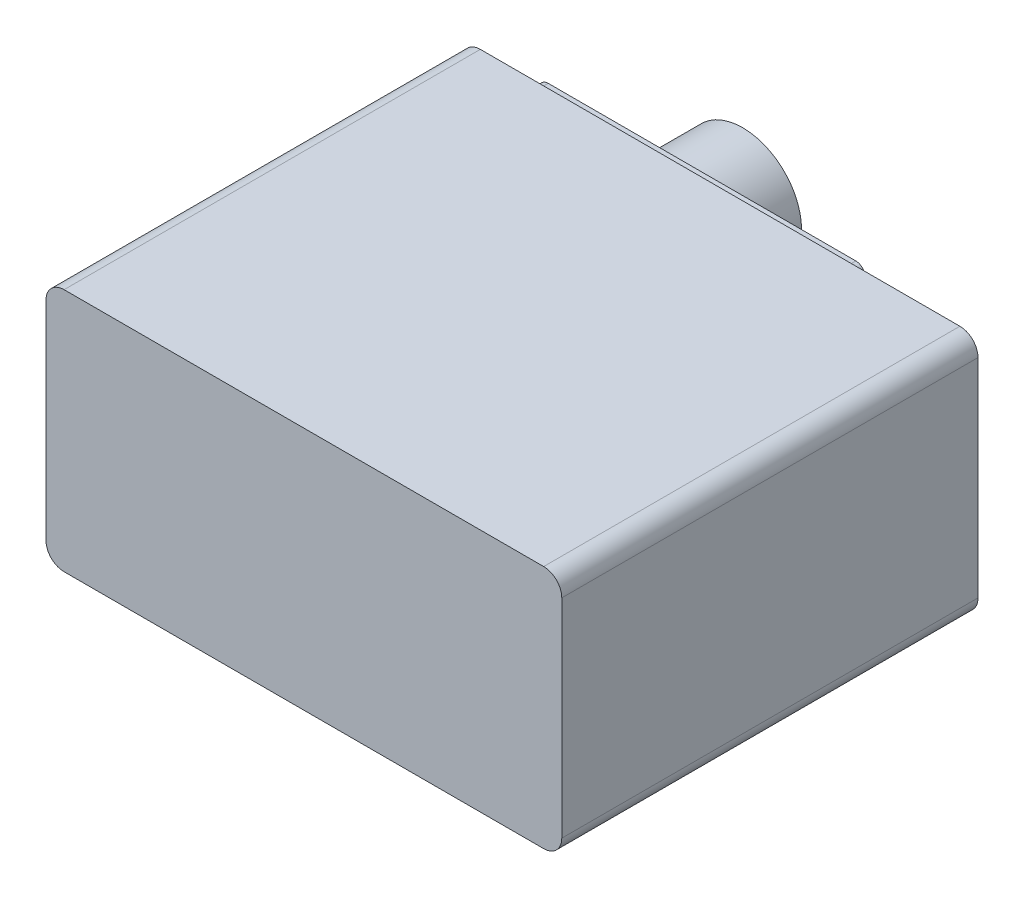
ISO-10303-21;
HEADER;
FILE_DESCRIPTION(('STEP AP214'),'2;1');
FILE_NAME('part.step','',(''),(''),'','','');
FILE_SCHEMA(('AUTOMOTIVE_DESIGN { 1 0 10303 214 1 1 1 1 }'));
ENDSEC;
DATA;
#1=APPLICATION_CONTEXT('core data for automotive mechanical design processes');
#2=APPLICATION_PROTOCOL_DEFINITION('international standard','automotive_design',2000,#1);
#3=PRODUCT_CONTEXT('',#1,'mechanical');
#4=PRODUCT('Part','Part','',(#3));
#5=PRODUCT_RELATED_PRODUCT_CATEGORY('part','',(#4));
#6=PRODUCT_DEFINITION_FORMATION('','',#4);
#7=PRODUCT_DEFINITION_CONTEXT('part definition',#1,'design');
#8=PRODUCT_DEFINITION('design','',#6,#7);
#9=PRODUCT_DEFINITION_SHAPE('','',#8);
#10=(LENGTH_UNIT() NAMED_UNIT(*) SI_UNIT(.MILLI.,.METRE.));
#11=(NAMED_UNIT(*) PLANE_ANGLE_UNIT() SI_UNIT($,.RADIAN.));
#12=(NAMED_UNIT(*) SI_UNIT($,.STERADIAN.) SOLID_ANGLE_UNIT());
#13=UNCERTAINTY_MEASURE_WITH_UNIT(LENGTH_MEASURE(1.E-05),#10,'distance_accuracy_value','');
#14=(GEOMETRIC_REPRESENTATION_CONTEXT(3) GLOBAL_UNCERTAINTY_ASSIGNED_CONTEXT((#13)) GLOBAL_UNIT_ASSIGNED_CONTEXT((#10,
#11,#12)) REPRESENTATION_CONTEXT('',''));
#15=CARTESIAN_POINT('',(0.,0.,0.));
#16=DIRECTION('',(0.,0.,1.));
#17=DIRECTION('',(1.,0.,0.));
#18=AXIS2_PLACEMENT_3D('',#15,#16,#17);
#19=CARTESIAN_POINT('',(12.,-10.,-4.));
#20=DIRECTION('',(-1.,0.,0.));
#21=DIRECTION('',(0.,0.,1.));
#22=AXIS2_PLACEMENT_3D('',#19,#20,#21);
#23=PLANE('',#22);
#24=DIRECTION('',(0.,0.,1.));
#25=VECTOR('',#24,1.);
#26=CARTESIAN_POINT('',(12.,-5.,-4.));
#27=LINE('',#26,#25);
#28=CARTESIAN_POINT('',(12.,-5.,-4.));
#29=VERTEX_POINT('',#28);
#30=CARTESIAN_POINT('',(12.,-5.,0.));
#31=VERTEX_POINT('',#30);
#32=EDGE_CURVE('E54',#29,#31,#27,.T.);
#33=ORIENTED_EDGE('',*,*,#32,.T.);
#34=DIRECTION('',(0.,-1.,0.));
#35=VECTOR('',#34,1.);
#36=CARTESIAN_POINT('',(12.,-10.,0.));
#37=LINE('',#36,#35);
#38=CARTESIAN_POINT('',(12.,-9.,0.));
#39=VERTEX_POINT('',#38);
#40=EDGE_CURVE('E203',#31,#39,#37,.T.);
#41=ORIENTED_EDGE('',*,*,#40,.T.);
#42=DIRECTION('',(0.,0.,1.));
#43=VECTOR('',#42,1.);
#44=CARTESIAN_POINT('',(12.,-9.,-4.));
#45=LINE('',#44,#43);
#46=CARTESIAN_POINT('',(12.,-9.,-4.));
#47=VERTEX_POINT('',#46);
#48=EDGE_CURVE('E270',#39,#47,#45,.F.);
#49=ORIENTED_EDGE('',*,*,#48,.T.);
#50=DIRECTION('',(0.,-1.,0.));
#51=VECTOR('',#50,1.);
#52=CARTESIAN_POINT('',(12.,-10.,-4.));
#53=LINE('',#52,#51);
#54=EDGE_CURVE('E188',#29,#47,#53,.T.);
#55=ORIENTED_EDGE('',*,*,#54,.F.);
#56=EDGE_LOOP('',(#33,#41,#49,#55));
#57=FACE_BOUND('',#56,.T.);
#58=ADVANCED_FACE('F39',(#57),#23,.F.);
#59=DIRECTION('',(0.,0.,1.));
#60=VECTOR('',#59,1.);
#61=CARTESIAN_POINT('',(12.,5.,-4.));
#62=LINE('',#61,#60);
#63=CARTESIAN_POINT('',(12.,5.,-4.));
#64=VERTEX_POINT('',#63);
#65=CARTESIAN_POINT('',(12.,5.,0.));
#66=VERTEX_POINT('',#65);
#67=EDGE_CURVE('E165',#64,#66,#62,.T.);
#68=ORIENTED_EDGE('',*,*,#67,.F.);
#69=CARTESIAN_POINT('',(12.,9.00000000000001,-4.));
#70=VERTEX_POINT('',#69);
#71=EDGE_CURVE('E177',#70,#64,#53,.T.);
#72=ORIENTED_EDGE('',*,*,#71,.F.);
#73=DIRECTION('',(0.,0.,1.));
#74=VECTOR('',#73,1.);
#75=CARTESIAN_POINT('',(12.,9.00000000000001,-4.));
#76=LINE('',#75,#74);
#77=CARTESIAN_POINT('',(12.,9.00000000000001,0.));
#78=VERTEX_POINT('',#77);
#79=EDGE_CURVE('E273',#70,#78,#76,.T.);
#80=ORIENTED_EDGE('',*,*,#79,.T.);
#81=EDGE_CURVE('E180',#78,#66,#37,.T.);
#82=ORIENTED_EDGE('',*,*,#81,.T.);
#83=EDGE_LOOP('',(#68,#72,#80,#82));
#84=FACE_BOUND('',#83,.T.);
#85=ADVANCED_FACE('F175',(#84),#23,.F.);
#86=CARTESIAN_POINT('',(0.,0.,0.));
#87=DIRECTION('',(0.,0.,1.));
#88=DIRECTION('',(1.,0.,0.));
#89=AXIS2_PLACEMENT_3D('',#86,#87,#88);
#90=PLANE('',#89);
#91=CARTESIAN_POINT('',(12.,0.,0.));
#92=DIRECTION('',(0.,0.,-1.));
#93=DIRECTION('',(-1.,0.,0.));
#94=AXIS2_PLACEMENT_3D('',#91,#92,#93);
#95=CIRCLE('',#94,5.);
#96=EDGE_CURVE('E170',#66,#31,#95,.T.);
#97=ORIENTED_EDGE('',*,*,#96,.F.);
#98=ORIENTED_EDGE('',*,*,#81,.F.);
#99=CARTESIAN_POINT('',(11.,9.00000000000001,0.));
#100=DIRECTION('',(0.,0.,1.));
#101=DIRECTION('',(1.,0.,0.));
#102=AXIS2_PLACEMENT_3D('',#99,#100,#101);
#103=CIRCLE('',#102,1.);
#104=CARTESIAN_POINT('',(11.,10.,0.));
#105=VERTEX_POINT('',#104);
#106=EDGE_CURVE('E297',#78,#105,#103,.T.);
#107=ORIENTED_EDGE('',*,*,#106,.T.);
#108=DIRECTION('',(1.,0.,0.));
#109=VECTOR('',#108,1.);
#110=CARTESIAN_POINT('',(12.,10.,0.));
#111=LINE('',#110,#109);
#112=CARTESIAN_POINT('',(-23.,10.,0.));
#113=VERTEX_POINT('',#112);
#114=EDGE_CURVE('E200',#113,#105,#111,.T.);
#115=ORIENTED_EDGE('',*,*,#114,.F.);
#116=CARTESIAN_POINT('',(-23.,9.,0.));
#117=DIRECTION('',(0.,0.,1.));
#118=DIRECTION('',(1.,0.,0.));
#119=AXIS2_PLACEMENT_3D('',#116,#117,#118);
#120=CIRCLE('',#119,1.);
#121=CARTESIAN_POINT('',(-24.,9.,0.));
#122=VERTEX_POINT('',#121);
#123=EDGE_CURVE('E299',#113,#122,#120,.T.);
#124=ORIENTED_EDGE('',*,*,#123,.T.);
#125=DIRECTION('',(0.,1.,0.));
#126=VECTOR('',#125,1.);
#127=CARTESIAN_POINT('',(-24.,10.,0.));
#128=LINE('',#127,#126);
#129=CARTESIAN_POINT('',(-24.,-9.,0.));
#130=VERTEX_POINT('',#129);
#131=EDGE_CURVE('E208',#130,#122,#128,.T.);
#132=ORIENTED_EDGE('',*,*,#131,.F.);
#133=CARTESIAN_POINT('',(-23.,-9.,0.));
#134=DIRECTION('',(0.,0.,1.));
#135=DIRECTION('',(1.,0.,0.));
#136=AXIS2_PLACEMENT_3D('',#133,#134,#135);
#137=CIRCLE('',#136,1.);
#138=CARTESIAN_POINT('',(-23.,-10.,0.));
#139=VERTEX_POINT('',#138);
#140=EDGE_CURVE('E62',#130,#139,#137,.T.);
#141=ORIENTED_EDGE('',*,*,#140,.T.);
#142=DIRECTION('',(-1.,0.,0.));
#143=VECTOR('',#142,1.);
#144=CARTESIAN_POINT('',(-24.,-10.,0.));
#145=LINE('',#144,#143);
#146=CARTESIAN_POINT('',(11.,-10.,0.));
#147=VERTEX_POINT('',#146);
#148=EDGE_CURVE('E206',#147,#139,#145,.T.);
#149=ORIENTED_EDGE('',*,*,#148,.F.);
#150=CARTESIAN_POINT('',(11.,-9.,0.));
#151=DIRECTION('',(0.,0.,1.));
#152=DIRECTION('',(1.,0.,0.));
#153=AXIS2_PLACEMENT_3D('',#150,#151,#152);
#154=CIRCLE('',#153,1.);
#155=EDGE_CURVE('E47',#147,#39,#154,.T.);
#156=ORIENTED_EDGE('',*,*,#155,.T.);
#157=ORIENTED_EDGE('',*,*,#40,.F.);
#158=EDGE_LOOP('',(#97,#98,#107,#115,#124,#132,#141,#149,#156,#157));
#159=FACE_BOUND('',#158,.T.);
#160=DIRECTION('',(0.,-1.,0.));
#161=VECTOR('',#160,1.);
#162=CARTESIAN_POINT('',(-28.5,13.5,0.));
#163=LINE('',#162,#161);
#164=CARTESIAN_POINT('',(-28.5,11.5,0.));
#165=VERTEX_POINT('',#164);
#166=CARTESIAN_POINT('',(-28.5,-11.5,0.));
#167=VERTEX_POINT('',#166);
#168=EDGE_CURVE('E215',#165,#167,#163,.T.);
#169=ORIENTED_EDGE('',*,*,#168,.F.);
#170=CARTESIAN_POINT('',(-26.5,11.5,0.));
#171=DIRECTION('',(0.,0.,1.));
#172=DIRECTION('',(1.,0.,0.));
#173=AXIS2_PLACEMENT_3D('',#170,#171,#172);
#174=CIRCLE('',#173,2.);
#175=CARTESIAN_POINT('',(-26.5,13.5,0.));
#176=VERTEX_POINT('',#175);
#177=EDGE_CURVE('E245',#165,#176,#174,.F.);
#178=ORIENTED_EDGE('',*,*,#177,.T.);
#179=DIRECTION('',(-1.,0.,0.));
#180=VECTOR('',#179,1.);
#181=CARTESIAN_POINT('',(28.5,13.5,0.));
#182=LINE('',#181,#180);
#183=CARTESIAN_POINT('',(26.5,13.5,0.));
#184=VERTEX_POINT('',#183);
#185=EDGE_CURVE('E230',#184,#176,#182,.T.);
#186=ORIENTED_EDGE('',*,*,#185,.F.);
#187=CARTESIAN_POINT('',(26.5,11.5,0.));
#188=DIRECTION('',(0.,0.,1.));
#189=DIRECTION('',(1.,0.,0.));
#190=AXIS2_PLACEMENT_3D('',#187,#188,#189);
#191=CIRCLE('',#190,2.);
#192=CARTESIAN_POINT('',(28.5,11.5,0.));
#193=VERTEX_POINT('',#192);
#194=EDGE_CURVE('E243',#184,#193,#191,.F.);
#195=ORIENTED_EDGE('',*,*,#194,.T.);
#196=DIRECTION('',(0.,1.,0.));
#197=VECTOR('',#196,1.);
#198=CARTESIAN_POINT('',(28.5,-13.5,0.));
#199=LINE('',#198,#197);
#200=CARTESIAN_POINT('',(28.5,-11.5,0.));
#201=VERTEX_POINT('',#200);
#202=EDGE_CURVE('E227',#201,#193,#199,.T.);
#203=ORIENTED_EDGE('',*,*,#202,.F.);
#204=CARTESIAN_POINT('',(26.5,-11.5,0.));
#205=DIRECTION('',(0.,0.,1.));
#206=DIRECTION('',(1.,0.,0.));
#207=AXIS2_PLACEMENT_3D('',#204,#205,#206);
#208=CIRCLE('',#207,2.);
#209=CARTESIAN_POINT('',(26.5,-13.5,0.));
#210=VERTEX_POINT('',#209);
#211=EDGE_CURVE('E241',#201,#210,#208,.F.);
#212=ORIENTED_EDGE('',*,*,#211,.T.);
#213=DIRECTION('',(1.,0.,0.));
#214=VECTOR('',#213,1.);
#215=CARTESIAN_POINT('',(0.,-13.5,0.));
#216=LINE('',#215,#214);
#217=CARTESIAN_POINT('',(-26.5,-13.5,0.));
#218=VERTEX_POINT('',#217);
#219=EDGE_CURVE('E199',#218,#210,#216,.T.);
#220=ORIENTED_EDGE('',*,*,#219,.F.);
#221=CARTESIAN_POINT('',(-26.5,-11.5,0.));
#222=DIRECTION('',(0.,0.,1.));
#223=DIRECTION('',(1.,0.,0.));
#224=AXIS2_PLACEMENT_3D('',#221,#222,#223);
#225=CIRCLE('',#224,2.);
#226=EDGE_CURVE('E239',#218,#167,#225,.F.);
#227=ORIENTED_EDGE('',*,*,#226,.T.);
#228=EDGE_LOOP('',(#169,#178,#186,#195,#203,#212,#220,#227));
#229=FACE_BOUND('',#228,.T.);
#230=ADVANCED_FACE('F304',(#159,#229),#90,.F.);
#231=CARTESIAN_POINT('',(0.,-13.5,46.));
#232=DIRECTION('',(0.,1.,0.));
#233=DIRECTION('',(0.,0.,1.));
#234=AXIS2_PLACEMENT_3D('',#231,#232,#233);
#235=PLANE('',#234);
#236=ORIENTED_EDGE('',*,*,#219,.T.);
#237=DIRECTION('',(0.,0.,-1.));
#238=VECTOR('',#237,1.);
#239=CARTESIAN_POINT('',(26.5,-13.5,46.));
#240=LINE('',#239,#238);
#241=CARTESIAN_POINT('',(26.5,-13.5,46.));
#242=VERTEX_POINT('',#241);
#243=EDGE_CURVE('E268',#210,#242,#240,.F.);
#244=ORIENTED_EDGE('',*,*,#243,.T.);
#245=DIRECTION('',(1.,0.,0.));
#246=VECTOR('',#245,1.);
#247=CARTESIAN_POINT('',(-28.5,-13.5,46.));
#248=LINE('',#247,#246);
#249=CARTESIAN_POINT('',(-26.5,-13.5,46.));
#250=VERTEX_POINT('',#249);
#251=EDGE_CURVE('E211',#250,#242,#248,.T.);
#252=ORIENTED_EDGE('',*,*,#251,.F.);
#253=DIRECTION('',(0.,0.,-1.));
#254=VECTOR('',#253,1.);
#255=CARTESIAN_POINT('',(-26.5,-13.5,46.));
#256=LINE('',#255,#254);
#257=EDGE_CURVE('E265',#250,#218,#256,.T.);
#258=ORIENTED_EDGE('',*,*,#257,.T.);
#259=EDGE_LOOP('',(#236,#244,#252,#258));
#260=FACE_BOUND('',#259,.T.);
#261=ADVANCED_FACE('F368',(#260),#235,.F.);
#262=CARTESIAN_POINT('',(28.5,-13.5,46.));
#263=DIRECTION('',(-1.,0.,0.));
#264=DIRECTION('',(0.,0.,1.));
#265=AXIS2_PLACEMENT_3D('',#262,#263,#264);
#266=PLANE('',#265);
#267=ORIENTED_EDGE('',*,*,#202,.T.);
#268=DIRECTION('',(0.,0.,-1.));
#269=VECTOR('',#268,1.);
#270=CARTESIAN_POINT('',(28.5,11.5,46.));
#271=LINE('',#270,#269);
#272=CARTESIAN_POINT('',(28.5,11.5,46.));
#273=VERTEX_POINT('',#272);
#274=EDGE_CURVE('E263',#193,#273,#271,.F.);
#275=ORIENTED_EDGE('',*,*,#274,.T.);
#276=DIRECTION('',(0.,1.,0.));
#277=VECTOR('',#276,1.);
#278=CARTESIAN_POINT('',(28.5,-13.5,46.));
#279=LINE('',#278,#277);
#280=CARTESIAN_POINT('',(28.5,-11.5,46.));
#281=VERTEX_POINT('',#280);
#282=EDGE_CURVE('E214',#281,#273,#279,.T.);
#283=ORIENTED_EDGE('',*,*,#282,.F.);
#284=DIRECTION('',(0.,0.,-1.));
#285=VECTOR('',#284,1.);
#286=CARTESIAN_POINT('',(28.5,-11.5,46.));
#287=LINE('',#286,#285);
#288=EDGE_CURVE('E260',#281,#201,#287,.T.);
#289=ORIENTED_EDGE('',*,*,#288,.T.);
#290=EDGE_LOOP('',(#267,#275,#283,#289));
#291=FACE_BOUND('',#290,.T.);
#292=ADVANCED_FACE('F375',(#291),#266,.F.);
#293=CARTESIAN_POINT('',(28.5,13.5,46.));
#294=DIRECTION('',(0.,-1.,0.));
#295=DIRECTION('',(1.,0.,0.));
#296=AXIS2_PLACEMENT_3D('',#293,#294,#295);
#297=PLANE('',#296);
#298=ORIENTED_EDGE('',*,*,#185,.T.);
#299=DIRECTION('',(0.,0.,-1.));
#300=VECTOR('',#299,1.);
#301=CARTESIAN_POINT('',(-26.5,13.5,46.));
#302=LINE('',#301,#300);
#303=CARTESIAN_POINT('',(-26.5,13.5,46.));
#304=VERTEX_POINT('',#303);
#305=EDGE_CURVE('E250',#176,#304,#302,.F.);
#306=ORIENTED_EDGE('',*,*,#305,.T.);
#307=DIRECTION('',(-1.,0.,0.));
#308=VECTOR('',#307,1.);
#309=CARTESIAN_POINT('',(28.5,13.5,46.));
#310=LINE('',#309,#308);
#311=CARTESIAN_POINT('',(26.5,13.5,46.));
#312=VERTEX_POINT('',#311);
#313=EDGE_CURVE('E218',#312,#304,#310,.T.);
#314=ORIENTED_EDGE('',*,*,#313,.F.);
#315=DIRECTION('',(0.,0.,-1.));
#316=VECTOR('',#315,1.);
#317=CARTESIAN_POINT('',(26.5,13.5,46.));
#318=LINE('',#317,#316);
#319=EDGE_CURVE('E247',#312,#184,#318,.T.);
#320=ORIENTED_EDGE('',*,*,#319,.T.);
#321=EDGE_LOOP('',(#298,#306,#314,#320));
#322=FACE_BOUND('',#321,.T.);
#323=ADVANCED_FACE('F371',(#322),#297,.F.);
#324=CARTESIAN_POINT('',(-28.5,13.5,46.));
#325=DIRECTION('',(1.,0.,0.));
#326=DIRECTION('',(0.,1.,0.));
#327=AXIS2_PLACEMENT_3D('',#324,#325,#326);
#328=PLANE('',#327);
#329=DIRECTION('',(0.,-1.,0.));
#330=VECTOR('',#329,1.);
#331=CARTESIAN_POINT('',(-28.5,13.5,46.));
#332=LINE('',#331,#330);
#333=CARTESIAN_POINT('',(-28.5,11.5,46.));
#334=VERTEX_POINT('',#333);
#335=CARTESIAN_POINT('',(-28.5,-11.5,46.));
#336=VERTEX_POINT('',#335);
#337=EDGE_CURVE('E221',#334,#336,#332,.T.);
#338=ORIENTED_EDGE('',*,*,#337,.F.);
#339=DIRECTION('',(0.,0.,-1.));
#340=VECTOR('',#339,1.);
#341=CARTESIAN_POINT('',(-28.5,11.5,46.));
#342=LINE('',#341,#340);
#343=EDGE_CURVE('E236',#334,#165,#342,.T.);
#344=ORIENTED_EDGE('',*,*,#343,.T.);
#345=ORIENTED_EDGE('',*,*,#168,.T.);
#346=DIRECTION('',(0.,0.,-1.));
#347=VECTOR('',#346,1.);
#348=CARTESIAN_POINT('',(-28.5,-11.5,46.));
#349=LINE('',#348,#347);
#350=EDGE_CURVE('E224',#167,#336,#349,.F.);
#351=ORIENTED_EDGE('',*,*,#350,.T.);
#352=EDGE_LOOP('',(#338,#344,#345,#351));
#353=FACE_BOUND('',#352,.T.);
#354=ADVANCED_FACE('F364',(#353),#328,.F.);
#355=CARTESIAN_POINT('',(0.,0.,46.));
#356=DIRECTION('',(0.,0.,1.));
#357=DIRECTION('',(1.,0.,0.));
#358=AXIS2_PLACEMENT_3D('',#355,#356,#357);
#359=PLANE('',#358);
#360=ORIENTED_EDGE('',*,*,#313,.T.);
#361=CARTESIAN_POINT('',(-26.5,11.5,46.));
#362=DIRECTION('',(0.,0.,1.));
#363=DIRECTION('',(1.,0.,0.));
#364=AXIS2_PLACEMENT_3D('',#361,#362,#363);
#365=CIRCLE('',#364,2.);
#366=EDGE_CURVE('E258',#304,#334,#365,.T.);
#367=ORIENTED_EDGE('',*,*,#366,.T.);
#368=ORIENTED_EDGE('',*,*,#337,.T.);
#369=CARTESIAN_POINT('',(-26.5,-11.5,46.));
#370=DIRECTION('',(0.,0.,1.));
#371=DIRECTION('',(1.,0.,0.));
#372=AXIS2_PLACEMENT_3D('',#369,#370,#371);
#373=CIRCLE('',#372,2.);
#374=EDGE_CURVE('E252',#336,#250,#373,.T.);
#375=ORIENTED_EDGE('',*,*,#374,.T.);
#376=ORIENTED_EDGE('',*,*,#251,.T.);
#377=CARTESIAN_POINT('',(26.5,-11.5,46.));
#378=DIRECTION('',(0.,0.,1.));
#379=DIRECTION('',(1.,0.,0.));
#380=AXIS2_PLACEMENT_3D('',#377,#378,#379);
#381=CIRCLE('',#380,2.);
#382=EDGE_CURVE('E254',#242,#281,#381,.T.);
#383=ORIENTED_EDGE('',*,*,#382,.T.);
#384=ORIENTED_EDGE('',*,*,#282,.T.);
#385=CARTESIAN_POINT('',(26.5,11.5,46.));
#386=DIRECTION('',(0.,0.,1.));
#387=DIRECTION('',(1.,0.,0.));
#388=AXIS2_PLACEMENT_3D('',#385,#386,#387);
#389=CIRCLE('',#388,2.);
#390=EDGE_CURVE('E256',#273,#312,#389,.T.);
#391=ORIENTED_EDGE('',*,*,#390,.T.);
#392=EDGE_LOOP('',(#360,#367,#368,#375,#376,#383,#384,#391));
#393=FACE_BOUND('',#392,.T.);
#394=ADVANCED_FACE('F360',(#393),#359,.T.);
#395=CARTESIAN_POINT('',(-26.5,11.5,46.));
#396=DIRECTION('',(0.,0.,-1.));
#397=DIRECTION('',(-1.,0.,0.));
#398=AXIS2_PLACEMENT_3D('',#395,#396,#397);
#399=CYLINDRICAL_SURFACE('',#398,2.);
#400=ORIENTED_EDGE('',*,*,#366,.F.);
#401=ORIENTED_EDGE('',*,*,#305,.F.);
#402=ORIENTED_EDGE('',*,*,#177,.F.);
#403=ORIENTED_EDGE('',*,*,#343,.F.);
#404=EDGE_LOOP('',(#400,#401,#402,#403));
#405=FACE_BOUND('',#404,.T.);
#406=ADVANCED_FACE('F363',(#405),#399,.T.);
#407=CARTESIAN_POINT('',(26.5,11.5,46.));
#408=DIRECTION('',(0.,0.,-1.));
#409=DIRECTION('',(-1.,0.,0.));
#410=AXIS2_PLACEMENT_3D('',#407,#408,#409);
#411=CYLINDRICAL_SURFACE('',#410,2.);
#412=ORIENTED_EDGE('',*,*,#390,.F.);
#413=ORIENTED_EDGE('',*,*,#274,.F.);
#414=ORIENTED_EDGE('',*,*,#194,.F.);
#415=ORIENTED_EDGE('',*,*,#319,.F.);
#416=EDGE_LOOP('',(#412,#413,#414,#415));
#417=FACE_BOUND('',#416,.T.);
#418=ADVANCED_FACE('F385',(#417),#411,.T.);
#419=CARTESIAN_POINT('',(26.5,-11.5,46.));
#420=DIRECTION('',(0.,0.,-1.));
#421=DIRECTION('',(-1.,0.,0.));
#422=AXIS2_PLACEMENT_3D('',#419,#420,#421);
#423=CYLINDRICAL_SURFACE('',#422,2.);
#424=ORIENTED_EDGE('',*,*,#382,.F.);
#425=ORIENTED_EDGE('',*,*,#243,.F.);
#426=ORIENTED_EDGE('',*,*,#211,.F.);
#427=ORIENTED_EDGE('',*,*,#288,.F.);
#428=EDGE_LOOP('',(#424,#425,#426,#427));
#429=FACE_BOUND('',#428,.T.);
#430=ADVANCED_FACE('F389',(#429),#423,.T.);
#431=CARTESIAN_POINT('',(-26.5,-11.5,46.));
#432=DIRECTION('',(0.,0.,-1.));
#433=DIRECTION('',(-1.,0.,0.));
#434=AXIS2_PLACEMENT_3D('',#431,#432,#433);
#435=CYLINDRICAL_SURFACE('',#434,2.);
#436=ORIENTED_EDGE('',*,*,#374,.F.);
#437=ORIENTED_EDGE('',*,*,#350,.F.);
#438=ORIENTED_EDGE('',*,*,#226,.F.);
#439=ORIENTED_EDGE('',*,*,#257,.F.);
#440=EDGE_LOOP('',(#436,#437,#438,#439));
#441=FACE_BOUND('',#440,.T.);
#442=ADVANCED_FACE('F358',(#441),#435,.T.);
#443=CARTESIAN_POINT('',(12.,10.,-4.));
#444=DIRECTION('',(0.,-1.,0.));
#445=DIRECTION('',(1.,0.,0.));
#446=AXIS2_PLACEMENT_3D('',#443,#444,#445);
#447=PLANE('',#446);
#448=ORIENTED_EDGE('',*,*,#114,.T.);
#449=DIRECTION('',(0.,0.,1.));
#450=VECTOR('',#449,1.);
#451=CARTESIAN_POINT('',(11.,10.,-4.));
#452=LINE('',#451,#450);
#453=CARTESIAN_POINT('',(11.,10.,-4.));
#454=VERTEX_POINT('',#453);
#455=EDGE_CURVE('E278',#105,#454,#452,.F.);
#456=ORIENTED_EDGE('',*,*,#455,.T.);
#457=DIRECTION('',(1.,0.,0.));
#458=VECTOR('',#457,1.);
#459=CARTESIAN_POINT('',(12.,10.,-4.));
#460=LINE('',#459,#458);
#461=CARTESIAN_POINT('',(-23.,10.,-4.));
#462=VERTEX_POINT('',#461);
#463=EDGE_CURVE('E193',#462,#454,#460,.T.);
#464=ORIENTED_EDGE('',*,*,#463,.F.);
#465=DIRECTION('',(0.,0.,1.));
#466=VECTOR('',#465,1.);
#467=CARTESIAN_POINT('',(-23.,10.,-4.));
#468=LINE('',#467,#466);
#469=EDGE_CURVE('E275',#462,#113,#468,.T.);
#470=ORIENTED_EDGE('',*,*,#469,.T.);
#471=EDGE_LOOP('',(#448,#456,#464,#470));
#472=FACE_BOUND('',#471,.T.);
#473=ADVANCED_FACE('F355',(#472),#447,.F.);
#474=CARTESIAN_POINT('',(-24.,-10.,-4.));
#475=DIRECTION('',(0.,1.,0.));
#476=DIRECTION('',(0.,0.,1.));
#477=AXIS2_PLACEMENT_3D('',#474,#475,#476);
#478=PLANE('',#477);
#479=ORIENTED_EDGE('',*,*,#148,.T.);
#480=DIRECTION('',(0.,0.,1.));
#481=VECTOR('',#480,1.);
#482=CARTESIAN_POINT('',(-23.,-10.,-4.));
#483=LINE('',#482,#481);
#484=CARTESIAN_POINT('',(-23.,-10.,-4.));
#485=VERTEX_POINT('',#484);
#486=EDGE_CURVE('E295',#139,#485,#483,.F.);
#487=ORIENTED_EDGE('',*,*,#486,.T.);
#488=DIRECTION('',(-1.,0.,0.));
#489=VECTOR('',#488,1.);
#490=CARTESIAN_POINT('',(-24.,-10.,-4.));
#491=LINE('',#490,#489);
#492=CARTESIAN_POINT('',(11.,-10.,-4.));
#493=VERTEX_POINT('',#492);
#494=EDGE_CURVE('E187',#493,#485,#491,.T.);
#495=ORIENTED_EDGE('',*,*,#494,.F.);
#496=DIRECTION('',(0.,0.,1.));
#497=VECTOR('',#496,1.);
#498=CARTESIAN_POINT('',(11.,-10.,-4.));
#499=LINE('',#498,#497);
#500=EDGE_CURVE('E292',#493,#147,#499,.T.);
#501=ORIENTED_EDGE('',*,*,#500,.T.);
#502=EDGE_LOOP('',(#479,#487,#495,#501));
#503=FACE_BOUND('',#502,.T.);
#504=ADVANCED_FACE('F345',(#503),#478,.F.);
#505=CARTESIAN_POINT('',(-24.,10.,-4.));
#506=DIRECTION('',(1.,0.,0.));
#507=DIRECTION('',(0.,1.,0.));
#508=AXIS2_PLACEMENT_3D('',#505,#506,#507);
#509=PLANE('',#508);
#510=ORIENTED_EDGE('',*,*,#131,.T.);
#511=DIRECTION('',(0.,0.,1.));
#512=VECTOR('',#511,1.);
#513=CARTESIAN_POINT('',(-24.,9.,-4.));
#514=LINE('',#513,#512);
#515=CARTESIAN_POINT('',(-24.,9.,-4.));
#516=VERTEX_POINT('',#515);
#517=EDGE_CURVE('E290',#122,#516,#514,.F.);
#518=ORIENTED_EDGE('',*,*,#517,.T.);
#519=DIRECTION('',(0.,1.,0.));
#520=VECTOR('',#519,1.);
#521=CARTESIAN_POINT('',(-24.,10.,-4.));
#522=LINE('',#521,#520);
#523=CARTESIAN_POINT('',(-24.,-9.,-4.));
#524=VERTEX_POINT('',#523);
#525=EDGE_CURVE('E191',#524,#516,#522,.T.);
#526=ORIENTED_EDGE('',*,*,#525,.F.);
#527=DIRECTION('',(0.,0.,1.));
#528=VECTOR('',#527,1.);
#529=CARTESIAN_POINT('',(-24.,-9.,-4.));
#530=LINE('',#529,#528);
#531=EDGE_CURVE('E287',#524,#130,#530,.T.);
#532=ORIENTED_EDGE('',*,*,#531,.T.);
#533=EDGE_LOOP('',(#510,#518,#526,#532));
#534=FACE_BOUND('',#533,.T.);
#535=ADVANCED_FACE('F336',(#534),#509,.F.);
#536=CARTESIAN_POINT('',(0.,0.,-4.));
#537=DIRECTION('',(0.,0.,1.));
#538=DIRECTION('',(1.,0.,0.));
#539=AXIS2_PLACEMENT_3D('',#536,#537,#538);
#540=PLANE('',#539);
#541=CARTESIAN_POINT('',(-11.5,0.,-4.));
#542=DIRECTION('',(0.,0.,1.));
#543=DIRECTION('',(1.,0.,0.));
#544=AXIS2_PLACEMENT_3D('',#541,#542,#543);
#545=CIRCLE('',#544,6.5);
#546=CARTESIAN_POINT('',(-5.,0.,-4.));
#547=VERTEX_POINT('',#546);
#548=EDGE_CURVE('E11',#547,#547,#545,.F.);
#549=ORIENTED_EDGE('',*,*,#548,.F.);
#550=EDGE_LOOP('',(#549));
#551=FACE_BOUND('',#550,.T.);
#552=ORIENTED_EDGE('',*,*,#463,.T.);
#553=CARTESIAN_POINT('',(11.,9.00000000000001,-4.));
#554=DIRECTION('',(0.,0.,1.));
#555=DIRECTION('',(1.,0.,0.));
#556=AXIS2_PLACEMENT_3D('',#553,#554,#555);
#557=CIRCLE('',#556,1.);
#558=EDGE_CURVE('E186',#454,#70,#557,.F.);
#559=ORIENTED_EDGE('',*,*,#558,.T.);
#560=ORIENTED_EDGE('',*,*,#71,.T.);
#561=CARTESIAN_POINT('',(12.,0.,-4.));
#562=DIRECTION('',(0.,0.,-1.));
#563=DIRECTION('',(-1.,0.,0.));
#564=AXIS2_PLACEMENT_3D('',#561,#562,#563);
#565=CIRCLE('',#564,5.);
#566=EDGE_CURVE('E162',#64,#29,#565,.T.);
#567=ORIENTED_EDGE('',*,*,#566,.T.);
#568=ORIENTED_EDGE('',*,*,#54,.T.);
#569=CARTESIAN_POINT('',(11.,-9.,-4.));
#570=DIRECTION('',(0.,0.,1.));
#571=DIRECTION('',(1.,0.,0.));
#572=AXIS2_PLACEMENT_3D('',#569,#570,#571);
#573=CIRCLE('',#572,1.);
#574=EDGE_CURVE('E280',#47,#493,#573,.F.);
#575=ORIENTED_EDGE('',*,*,#574,.T.);
#576=ORIENTED_EDGE('',*,*,#494,.T.);
#577=CARTESIAN_POINT('',(-23.,-9.,-4.));
#578=DIRECTION('',(0.,0.,1.));
#579=DIRECTION('',(1.,0.,0.));
#580=AXIS2_PLACEMENT_3D('',#577,#578,#579);
#581=CIRCLE('',#580,1.);
#582=EDGE_CURVE('E282',#485,#524,#581,.F.);
#583=ORIENTED_EDGE('',*,*,#582,.T.);
#584=ORIENTED_EDGE('',*,*,#525,.T.);
#585=CARTESIAN_POINT('',(-23.,9.,-4.));
#586=DIRECTION('',(0.,0.,1.));
#587=DIRECTION('',(1.,0.,0.));
#588=AXIS2_PLACEMENT_3D('',#585,#586,#587);
#589=CIRCLE('',#588,1.);
#590=EDGE_CURVE('E284',#516,#462,#589,.F.);
#591=ORIENTED_EDGE('',*,*,#590,.T.);
#592=EDGE_LOOP('',(#552,#559,#560,#567,#568,#575,#576,#583,#584,#591));
#593=FACE_BOUND('',#592,.T.);
#594=ADVANCED_FACE('F184',(#551,#593),#540,.F.);
#595=CARTESIAN_POINT('',(11.,9.00000000000001,-4.));
#596=DIRECTION('',(0.,0.,1.));
#597=DIRECTION('',(1.,0.,0.));
#598=AXIS2_PLACEMENT_3D('',#595,#596,#597);
#599=CYLINDRICAL_SURFACE('',#598,1.);
#600=ORIENTED_EDGE('',*,*,#558,.F.);
#601=ORIENTED_EDGE('',*,*,#455,.F.);
#602=ORIENTED_EDGE('',*,*,#106,.F.);
#603=ORIENTED_EDGE('',*,*,#79,.F.);
#604=EDGE_LOOP('',(#600,#601,#602,#603));
#605=FACE_BOUND('',#604,.T.);
#606=ADVANCED_FACE('F335',(#605),#599,.T.);
#607=CARTESIAN_POINT('',(-23.,9.,-4.));
#608=DIRECTION('',(0.,0.,1.));
#609=DIRECTION('',(1.,0.,0.));
#610=AXIS2_PLACEMENT_3D('',#607,#608,#609);
#611=CYLINDRICAL_SURFACE('',#610,1.);
#612=ORIENTED_EDGE('',*,*,#590,.F.);
#613=ORIENTED_EDGE('',*,*,#517,.F.);
#614=ORIENTED_EDGE('',*,*,#123,.F.);
#615=ORIENTED_EDGE('',*,*,#469,.F.);
#616=EDGE_LOOP('',(#612,#613,#614,#615));
#617=FACE_BOUND('',#616,.T.);
#618=ADVANCED_FACE('F342',(#617),#611,.T.);
#619=CARTESIAN_POINT('',(-23.,-9.,-4.));
#620=DIRECTION('',(0.,0.,1.));
#621=DIRECTION('',(1.,0.,0.));
#622=AXIS2_PLACEMENT_3D('',#619,#620,#621);
#623=CYLINDRICAL_SURFACE('',#622,1.);
#624=ORIENTED_EDGE('',*,*,#582,.F.);
#625=ORIENTED_EDGE('',*,*,#486,.F.);
#626=ORIENTED_EDGE('',*,*,#140,.F.);
#627=ORIENTED_EDGE('',*,*,#531,.F.);
#628=EDGE_LOOP('',(#624,#625,#626,#627));
#629=FACE_BOUND('',#628,.T.);
#630=ADVANCED_FACE('F398',(#629),#623,.T.);
#631=CARTESIAN_POINT('',(11.,-9.,-4.));
#632=DIRECTION('',(0.,0.,1.));
#633=DIRECTION('',(1.,0.,0.));
#634=AXIS2_PLACEMENT_3D('',#631,#632,#633);
#635=CYLINDRICAL_SURFACE('',#634,1.);
#636=ORIENTED_EDGE('',*,*,#574,.F.);
#637=ORIENTED_EDGE('',*,*,#48,.F.);
#638=ORIENTED_EDGE('',*,*,#155,.F.);
#639=ORIENTED_EDGE('',*,*,#500,.F.);
#640=EDGE_LOOP('',(#636,#637,#638,#639));
#641=FACE_BOUND('',#640,.T.);
#642=ADVANCED_FACE('F41',(#641),#635,.T.);
#643=CARTESIAN_POINT('',(-11.5,0.,-14.));
#644=DIRECTION('',(0.,0.,1.));
#645=DIRECTION('',(1.,0.,0.));
#646=AXIS2_PLACEMENT_3D('',#643,#644,#645);
#647=CYLINDRICAL_SURFACE('',#646,6.5);
#648=CARTESIAN_POINT('',(-11.5,0.,-14.));
#649=DIRECTION('',(0.,0.,-1.));
#650=DIRECTION('',(-1.,0.,0.));
#651=AXIS2_PLACEMENT_3D('',#648,#649,#650);
#652=CIRCLE('',#651,6.5);
#653=CARTESIAN_POINT('',(-18.,0.,-14.));
#654=VERTEX_POINT('',#653);
#655=EDGE_CURVE('E204',#654,#654,#652,.T.);
#656=ORIENTED_EDGE('',*,*,#655,.F.);
#657=EDGE_LOOP('',(#656));
#658=FACE_BOUND('',#657,.T.);
#659=ORIENTED_EDGE('',*,*,#548,.T.);
#660=EDGE_LOOP('',(#659));
#661=FACE_BOUND('',#660,.T.);
#662=ADVANCED_FACE('F328',(#658,#661),#647,.T.);
#663=CARTESIAN_POINT('',(-11.5,0.,-14.));
#664=DIRECTION('',(0.,0.,-1.));
#665=DIRECTION('',(-1.,0.,0.));
#666=AXIS2_PLACEMENT_3D('',#663,#664,#665);
#667=PLANE('',#666);
#668=CARTESIAN_POINT('',(-11.5,0.,-14.));
#669=DIRECTION('',(0.,0.,-1.));
#670=DIRECTION('',(-1.,0.,0.));
#671=AXIS2_PLACEMENT_3D('',#668,#669,#670);
#672=CIRCLE('',#671,5.);
#673=CARTESIAN_POINT('',(-16.5,0.,-14.));
#674=VERTEX_POINT('',#673);
#675=EDGE_CURVE('E316',#674,#674,#672,.T.);
#676=ORIENTED_EDGE('',*,*,#675,.F.);
#677=EDGE_LOOP('',(#676));
#678=FACE_BOUND('',#677,.T.);
#679=ORIENTED_EDGE('',*,*,#655,.T.);
#680=EDGE_LOOP('',(#679));
#681=FACE_BOUND('',#680,.T.);
#682=ADVANCED_FACE('F326',(#678,#681),#667,.T.);
#683=CARTESIAN_POINT('',(-11.5,0.,-12.));
#684=DIRECTION('',(0.,0.,-1.));
#685=DIRECTION('',(-1.,0.,0.));
#686=AXIS2_PLACEMENT_3D('',#683,#684,#685);
#687=CYLINDRICAL_SURFACE('',#686,5.);
#688=CARTESIAN_POINT('',(-11.5,0.,-12.));
#689=DIRECTION('',(0.,0.,-1.));
#690=DIRECTION('',(-1.,0.,0.));
#691=AXIS2_PLACEMENT_3D('',#688,#689,#690);
#692=CIRCLE('',#691,5.);
#693=CARTESIAN_POINT('',(-16.5,0.,-12.));
#694=VERTEX_POINT('',#693);
#695=EDGE_CURVE('E319',#694,#694,#692,.T.);
#696=ORIENTED_EDGE('',*,*,#695,.F.);
#697=EDGE_LOOP('',(#696));
#698=FACE_BOUND('',#697,.T.);
#699=ORIENTED_EDGE('',*,*,#675,.T.);
#700=EDGE_LOOP('',(#699));
#701=FACE_BOUND('',#700,.T.);
#702=ADVANCED_FACE('F464',(#698,#701),#687,.F.);
#703=CARTESIAN_POINT('',(-11.5,0.,-12.));
#704=DIRECTION('',(0.,0.,-1.));
#705=DIRECTION('',(-1.,0.,0.));
#706=AXIS2_PLACEMENT_3D('',#703,#704,#705);
#707=PLANE('',#706);
#708=CARTESIAN_POINT('',(-11.5,0.,-12.));
#709=DIRECTION('',(0.,0.,-1.));
#710=DIRECTION('',(-1.,0.,0.));
#711=AXIS2_PLACEMENT_3D('',#708,#709,#710);
#712=CIRCLE('',#711,3.);
#713=CARTESIAN_POINT('',(-14.5,0.,-12.));
#714=VERTEX_POINT('',#713);
#715=EDGE_CURVE('E313',#714,#714,#712,.T.);
#716=ORIENTED_EDGE('',*,*,#715,.F.);
#717=EDGE_LOOP('',(#716));
#718=FACE_BOUND('',#717,.T.);
#719=ORIENTED_EDGE('',*,*,#695,.T.);
#720=EDGE_LOOP('',(#719));
#721=FACE_BOUND('',#720,.T.);
#722=ADVANCED_FACE('F476',(#718,#721),#707,.T.);
#723=CARTESIAN_POINT('',(-11.5,0.,-12.));
#724=DIRECTION('',(0.,0.,-1.));
#725=DIRECTION('',(-1.,0.,0.));
#726=AXIS2_PLACEMENT_3D('',#723,#724,#725);
#727=CYLINDRICAL_SURFACE('',#726,3.);
#728=ORIENTED_EDGE('',*,*,#715,.T.);
#729=EDGE_LOOP('',(#728));
#730=FACE_BOUND('',#729,.T.);
#731=CARTESIAN_POINT('',(-11.5,0.,-14.));
#732=DIRECTION('',(0.,0.,-1.));
#733=DIRECTION('',(-1.,0.,0.));
#734=AXIS2_PLACEMENT_3D('',#731,#732,#733);
#735=CIRCLE('',#734,3.);
#736=CARTESIAN_POINT('',(-14.5,0.,-14.));
#737=VERTEX_POINT('',#736);
#738=EDGE_CURVE('E181',#737,#737,#735,.T.);
#739=ORIENTED_EDGE('',*,*,#738,.F.);
#740=EDGE_LOOP('',(#739));
#741=FACE_BOUND('',#740,.T.);
#742=ADVANCED_FACE('F486',(#730,#741),#727,.T.);
#743=ORIENTED_EDGE('',*,*,#738,.T.);
#744=EDGE_LOOP('',(#743));
#745=FACE_BOUND('',#744,.T.);
#746=ADVANCED_FACE('F467',(#745),#667,.T.);
#747=CARTESIAN_POINT('',(12.,0.,-4.));
#748=DIRECTION('',(0.,0.,1.));
#749=DIRECTION('',(1.,0.,0.));
#750=AXIS2_PLACEMENT_3D('',#747,#748,#749);
#751=CYLINDRICAL_SURFACE('',#750,5.);
#752=ORIENTED_EDGE('',*,*,#96,.T.);
#753=ORIENTED_EDGE('',*,*,#32,.F.);
#754=ORIENTED_EDGE('',*,*,#566,.F.);
#755=ORIENTED_EDGE('',*,*,#67,.T.);
#756=EDGE_LOOP('',(#752,#753,#754,#755));
#757=FACE_BOUND('',#756,.T.);
#758=ADVANCED_FACE('F164',(#757),#751,.T.);
#759=CLOSED_SHELL('',(#58,#85,#230,#261,#292,#323,#354,#394,#406,#418,#430,#442,#473,#504,#535,
#594,#606,#618,#630,#642,#662,#682,#702,#722,#742,#746,#758));
#760=MANIFOLD_SOLID_BREP('B2',#759);
#761=ADVANCED_BREP_SHAPE_REPRESENTATION('',(#18,#760),#14);
#762=SHAPE_DEFINITION_REPRESENTATION(#9,#761);
ENDSEC;
END-ISO-10303-21;
